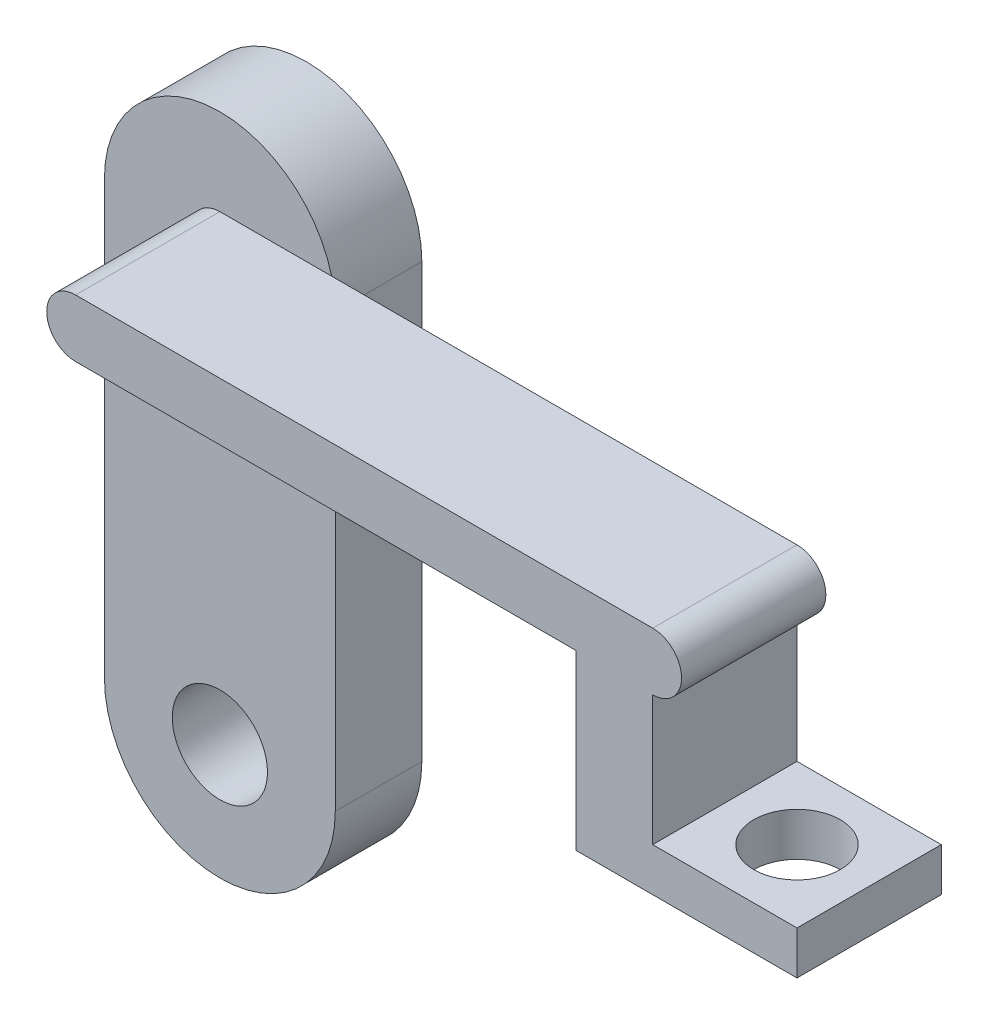
ISO-10303-21;
HEADER;
FILE_DESCRIPTION(('STEP AP214'),'2;1');
FILE_NAME('part.step','',(''),(''),'','','');
FILE_SCHEMA(('AUTOMOTIVE_DESIGN { 1 0 10303 214 1 1 1 1 }'));
ENDSEC;
DATA;
#1=APPLICATION_CONTEXT('core data for automotive mechanical design processes');
#2=APPLICATION_PROTOCOL_DEFINITION('international standard','automotive_design',2000,#1);
#3=PRODUCT_CONTEXT('',#1,'mechanical');
#4=PRODUCT('Part','Part','',(#3));
#5=PRODUCT_RELATED_PRODUCT_CATEGORY('part','',(#4));
#6=PRODUCT_DEFINITION_FORMATION('','',#4);
#7=PRODUCT_DEFINITION_CONTEXT('part definition',#1,'design');
#8=PRODUCT_DEFINITION('design','',#6,#7);
#9=PRODUCT_DEFINITION_SHAPE('','',#8);
#10=(LENGTH_UNIT() NAMED_UNIT(*) SI_UNIT(.MILLI.,.METRE.));
#11=(NAMED_UNIT(*) PLANE_ANGLE_UNIT() SI_UNIT($,.RADIAN.));
#12=(NAMED_UNIT(*) SI_UNIT($,.STERADIAN.) SOLID_ANGLE_UNIT());
#13=UNCERTAINTY_MEASURE_WITH_UNIT(LENGTH_MEASURE(1.E-05),#10,'distance_accuracy_value','');
#14=(GEOMETRIC_REPRESENTATION_CONTEXT(3) GLOBAL_UNCERTAINTY_ASSIGNED_CONTEXT((#13)) GLOBAL_UNIT_ASSIGNED_CONTEXT((#10,
#11,#12)) REPRESENTATION_CONTEXT('',''));
#15=CARTESIAN_POINT('',(0.,0.,0.));
#16=DIRECTION('',(0.,0.,1.));
#17=DIRECTION('',(1.,0.,0.));
#18=AXIS2_PLACEMENT_3D('',#15,#16,#17);
#19=CARTESIAN_POINT('',(20.,8.,8.));
#20=DIRECTION('',(-1.,0.,0.));
#21=DIRECTION('',(0.,0.,1.));
#22=AXIS2_PLACEMENT_3D('',#19,#20,#21);
#23=PLANE('',#22);
#24=DIRECTION('',(0.,0.,1.));
#25=VECTOR('',#24,1.);
#26=CARTESIAN_POINT('',(20.,9.50212823380525,8.));
#27=LINE('',#26,#25);
#28=CARTESIAN_POINT('',(20.,9.50212823380525,3.));
#29=VERTEX_POINT('',#28);
#30=CARTESIAN_POINT('',(20.,9.50212823380525,8.));
#31=VERTEX_POINT('',#30);
#32=EDGE_CURVE('E57',#29,#31,#27,.T.);
#33=ORIENTED_EDGE('',*,*,#32,.F.);
#34=DIRECTION('',(0.,1.,0.));
#35=VECTOR('',#34,1.);
#36=CARTESIAN_POINT('',(20.,8.,3.));
#37=LINE('',#36,#35);
#38=CARTESIAN_POINT('',(20.,14.,3.));
#39=VERTEX_POINT('',#38);
#40=EDGE_CURVE('E182',#29,#39,#37,.T.);
#41=ORIENTED_EDGE('',*,*,#40,.T.);
#42=DIRECTION('',(0.,0.,-1.));
#43=VECTOR('',#42,1.);
#44=CARTESIAN_POINT('',(20.,14.,8.));
#45=LINE('',#44,#43);
#46=CARTESIAN_POINT('',(20.,14.,8.));
#47=VERTEX_POINT('',#46);
#48=EDGE_CURVE('E219',#47,#39,#45,.T.);
#49=ORIENTED_EDGE('',*,*,#48,.F.);
#50=DIRECTION('',(0.,1.,0.));
#51=VECTOR('',#50,1.);
#52=CARTESIAN_POINT('',(20.,8.,8.));
#53=LINE('',#52,#51);
#54=EDGE_CURVE('E188',#31,#47,#53,.T.);
#55=ORIENTED_EDGE('',*,*,#54,.F.);
#56=EDGE_LOOP('',(#33,#41,#49,#55));
#57=FACE_BOUND('',#56,.T.);
#58=ADVANCED_FACE('F39',(#57),#23,.F.);
#59=CARTESIAN_POINT('',(0.,14.,8.));
#60=DIRECTION('',(0.,1.,0.));
#61=DIRECTION('',(0.,0.,1.));
#62=AXIS2_PLACEMENT_3D('',#59,#60,#61);
#63=PLANE('',#62);
#64=DIRECTION('',(0.,0.,-1.));
#65=VECTOR('',#64,1.);
#66=CARTESIAN_POINT('',(17.3441823212465,14.,8.));
#67=LINE('',#66,#65);
#68=CARTESIAN_POINT('',(17.3441823212465,14.,8.));
#69=VERTEX_POINT('',#68);
#70=CARTESIAN_POINT('',(17.3441823212465,14.,3.));
#71=VERTEX_POINT('',#70);
#72=EDGE_CURVE('E61',#69,#71,#67,.T.);
#73=ORIENTED_EDGE('',*,*,#72,.F.);
#74=DIRECTION('',(1.,0.,0.));
#75=VECTOR('',#74,1.);
#76=CARTESIAN_POINT('',(0.,14.,8.));
#77=LINE('',#76,#75);
#78=CARTESIAN_POINT('',(0.,14.,8.));
#79=VERTEX_POINT('',#78);
#80=EDGE_CURVE('E193',#79,#69,#77,.T.);
#81=ORIENTED_EDGE('',*,*,#80,.F.);
#82=DIRECTION('',(0.,0.,-1.));
#83=VECTOR('',#82,1.);
#84=CARTESIAN_POINT('',(0.,14.,8.));
#85=LINE('',#84,#83);
#86=CARTESIAN_POINT('',(0.,14.,3.));
#87=VERTEX_POINT('',#86);
#88=EDGE_CURVE('E218',#79,#87,#85,.T.);
#89=ORIENTED_EDGE('',*,*,#88,.T.);
#90=DIRECTION('',(1.,0.,0.));
#91=VECTOR('',#90,1.);
#92=CARTESIAN_POINT('',(0.,14.,3.));
#93=LINE('',#92,#91);
#94=CARTESIAN_POINT('',(4.,14.,3.));
#95=VERTEX_POINT('',#94);
#96=EDGE_CURVE('E203',#87,#95,#93,.T.);
#97=ORIENTED_EDGE('',*,*,#96,.T.);
#98=EDGE_CURVE('E201',#95,#71,#93,.T.);
#99=ORIENTED_EDGE('',*,*,#98,.T.);
#100=EDGE_LOOP('',(#73,#81,#89,#97,#99));
#101=FACE_BOUND('',#100,.T.);
#102=ADVANCED_FACE('F297',(#101),#63,.F.);
#103=CARTESIAN_POINT('',(0.,0.,3.));
#104=DIRECTION('',(0.,0.,1.));
#105=DIRECTION('',(1.,0.,0.));
#106=AXIS2_PLACEMENT_3D('',#103,#104,#105);
#107=PLANE('',#106);
#108=DIRECTION('',(-1.,0.,0.));
#109=VECTOR('',#108,1.);
#110=CARTESIAN_POINT('',(0.,16.,3.));
#111=LINE('',#110,#109);
#112=CARTESIAN_POINT('',(3.87298334620742,16.,3.));
#113=VERTEX_POINT('',#112);
#114=CARTESIAN_POINT('',(0.,16.,3.));
#115=VERTEX_POINT('',#114);
#116=EDGE_CURVE('E11',#113,#115,#111,.T.);
#117=ORIENTED_EDGE('',*,*,#116,.F.);
#118=CARTESIAN_POINT('',(0.,15.,3.));
#119=DIRECTION('',(0.,0.,1.));
#120=DIRECTION('',(1.,0.,0.));
#121=AXIS2_PLACEMENT_3D('',#118,#119,#120);
#122=CIRCLE('',#121,4.);
#123=CARTESIAN_POINT('',(-4.,15.,3.));
#124=VERTEX_POINT('',#123);
#125=EDGE_CURVE('E236',#113,#124,#122,.T.);
#126=ORIENTED_EDGE('',*,*,#125,.T.);
#127=DIRECTION('',(0.,-1.,0.));
#128=VECTOR('',#127,1.);
#129=CARTESIAN_POINT('',(-4.,0.,3.));
#130=LINE('',#129,#128);
#131=CARTESIAN_POINT('',(-4.,0.,3.));
#132=VERTEX_POINT('',#131);
#133=EDGE_CURVE('E239',#124,#132,#130,.T.);
#134=ORIENTED_EDGE('',*,*,#133,.T.);
#135=CARTESIAN_POINT('',(0.,0.,3.));
#136=DIRECTION('',(0.,0.,1.));
#137=DIRECTION('',(1.,0.,0.));
#138=AXIS2_PLACEMENT_3D('',#135,#136,#137);
#139=CIRCLE('',#138,4.);
#140=CARTESIAN_POINT('',(4.,0.,3.));
#141=VERTEX_POINT('',#140);
#142=EDGE_CURVE('E230',#132,#141,#139,.T.);
#143=ORIENTED_EDGE('',*,*,#142,.T.);
#144=DIRECTION('',(0.,1.,0.));
#145=VECTOR('',#144,1.);
#146=CARTESIAN_POINT('',(4.,0.,3.));
#147=LINE('',#146,#145);
#148=EDGE_CURVE('E234',#141,#95,#147,.T.);
#149=ORIENTED_EDGE('',*,*,#148,.T.);
#150=ORIENTED_EDGE('',*,*,#96,.F.);
#151=CARTESIAN_POINT('',(0.,15.,3.));
#152=DIRECTION('',(0.,0.,1.));
#153=DIRECTION('',(1.,0.,0.));
#154=AXIS2_PLACEMENT_3D('',#151,#152,#153);
#155=CIRCLE('',#154,1.);
#156=EDGE_CURVE('E195',#115,#87,#155,.T.);
#157=ORIENTED_EDGE('',*,*,#156,.F.);
#158=EDGE_LOOP('',(#117,#126,#134,#143,#149,#150,#157));
#159=FACE_BOUND('',#158,.T.);
#160=CARTESIAN_POINT('',(0.,0.,3.));
#161=DIRECTION('',(0.,0.,1.));
#162=DIRECTION('',(1.,0.,0.));
#163=AXIS2_PLACEMENT_3D('',#160,#161,#162);
#164=CIRCLE('',#163,1.65);
#165=CARTESIAN_POINT('',(1.65,0.,3.));
#166=VERTEX_POINT('',#165);
#167=EDGE_CURVE('E224',#166,#166,#164,.T.);
#168=ORIENTED_EDGE('',*,*,#167,.F.);
#169=EDGE_LOOP('',(#168));
#170=FACE_BOUND('',#169,.T.);
#171=ADVANCED_FACE('F276',(#159,#170),#107,.T.);
#172=CARTESIAN_POINT('',(0.,0.,0.));
#173=DIRECTION('',(0.,0.,1.));
#174=DIRECTION('',(1.,0.,0.));
#175=AXIS2_PLACEMENT_3D('',#172,#173,#174);
#176=PLANE('',#175);
#177=CARTESIAN_POINT('',(0.,0.,0.));
#178=DIRECTION('',(0.,0.,1.));
#179=DIRECTION('',(1.,0.,0.));
#180=AXIS2_PLACEMENT_3D('',#177,#178,#179);
#181=CIRCLE('',#180,4.);
#182=CARTESIAN_POINT('',(-4.,0.,0.));
#183=VERTEX_POINT('',#182);
#184=CARTESIAN_POINT('',(4.,0.,0.));
#185=VERTEX_POINT('',#184);
#186=EDGE_CURVE('E228',#183,#185,#181,.T.);
#187=ORIENTED_EDGE('',*,*,#186,.F.);
#188=DIRECTION('',(0.,-1.,0.));
#189=VECTOR('',#188,1.);
#190=CARTESIAN_POINT('',(-4.,0.,0.));
#191=LINE('',#190,#189);
#192=CARTESIAN_POINT('',(-4.,15.,0.));
#193=VERTEX_POINT('',#192);
#194=EDGE_CURVE('E231',#193,#183,#191,.T.);
#195=ORIENTED_EDGE('',*,*,#194,.F.);
#196=CARTESIAN_POINT('',(0.,15.,0.));
#197=DIRECTION('',(0.,0.,1.));
#198=DIRECTION('',(1.,0.,0.));
#199=AXIS2_PLACEMENT_3D('',#196,#197,#198);
#200=CIRCLE('',#199,4.);
#201=CARTESIAN_POINT('',(4.,15.,0.));
#202=VERTEX_POINT('',#201);
#203=EDGE_CURVE('E250',#202,#193,#200,.T.);
#204=ORIENTED_EDGE('',*,*,#203,.F.);
#205=DIRECTION('',(0.,1.,0.));
#206=VECTOR('',#205,1.);
#207=CARTESIAN_POINT('',(4.,0.,0.));
#208=LINE('',#207,#206);
#209=EDGE_CURVE('E244',#185,#202,#208,.T.);
#210=ORIENTED_EDGE('',*,*,#209,.F.);
#211=EDGE_LOOP('',(#187,#195,#204,#210));
#212=FACE_BOUND('',#211,.T.);
#213=CARTESIAN_POINT('',(0.,0.,0.));
#214=DIRECTION('',(0.,0.,1.));
#215=DIRECTION('',(1.,0.,0.));
#216=AXIS2_PLACEMENT_3D('',#213,#214,#215);
#217=CIRCLE('',#216,1.65);
#218=CARTESIAN_POINT('',(1.65,0.,0.));
#219=VERTEX_POINT('',#218);
#220=EDGE_CURVE('E225',#219,#219,#217,.T.);
#221=ORIENTED_EDGE('',*,*,#220,.T.);
#222=EDGE_LOOP('',(#221));
#223=FACE_BOUND('',#222,.T.);
#224=ADVANCED_FACE('F268',(#212,#223),#176,.F.);
#225=CARTESIAN_POINT('',(0.,0.,3.));
#226=DIRECTION('',(0.,0.,-1.));
#227=DIRECTION('',(-1.,0.,0.));
#228=AXIS2_PLACEMENT_3D('',#225,#226,#227);
#229=CYLINDRICAL_SURFACE('',#228,4.);
#230=ORIENTED_EDGE('',*,*,#186,.T.);
#231=DIRECTION('',(0.,0.,-1.));
#232=VECTOR('',#231,1.);
#233=CARTESIAN_POINT('',(4.,0.,3.));
#234=LINE('',#233,#232);
#235=EDGE_CURVE('E43',#141,#185,#234,.T.);
#236=ORIENTED_EDGE('',*,*,#235,.F.);
#237=ORIENTED_EDGE('',*,*,#142,.F.);
#238=DIRECTION('',(0.,0.,-1.));
#239=VECTOR('',#238,1.);
#240=CARTESIAN_POINT('',(-4.,0.,3.));
#241=LINE('',#240,#239);
#242=EDGE_CURVE('E245',#132,#183,#241,.T.);
#243=ORIENTED_EDGE('',*,*,#242,.T.);
#244=EDGE_LOOP('',(#230,#236,#237,#243));
#245=FACE_BOUND('',#244,.T.);
#246=ADVANCED_FACE('F41',(#245),#229,.T.);
#247=CARTESIAN_POINT('',(4.,0.,3.));
#248=DIRECTION('',(-1.,0.,0.));
#249=DIRECTION('',(0.,0.,1.));
#250=AXIS2_PLACEMENT_3D('',#247,#248,#249);
#251=PLANE('',#250);
#252=ORIENTED_EDGE('',*,*,#209,.T.);
#253=DIRECTION('',(0.,0.,-1.));
#254=VECTOR('',#253,1.);
#255=CARTESIAN_POINT('',(4.,15.,3.));
#256=LINE('',#255,#254);
#257=CARTESIAN_POINT('',(4.,15.,3.));
#258=VERTEX_POINT('',#257);
#259=EDGE_CURVE('E251',#258,#202,#256,.T.);
#260=ORIENTED_EDGE('',*,*,#259,.F.);
#261=EDGE_CURVE('E235',#95,#258,#147,.T.);
#262=ORIENTED_EDGE('',*,*,#261,.F.);
#263=ORIENTED_EDGE('',*,*,#148,.F.);
#264=ORIENTED_EDGE('',*,*,#235,.T.);
#265=EDGE_LOOP('',(#252,#260,#262,#263,#264));
#266=FACE_BOUND('',#265,.T.);
#267=ADVANCED_FACE('F261',(#266),#251,.F.);
#268=CARTESIAN_POINT('',(0.,15.,3.));
#269=DIRECTION('',(0.,0.,-1.));
#270=DIRECTION('',(-1.,0.,0.));
#271=AXIS2_PLACEMENT_3D('',#268,#269,#270);
#272=CYLINDRICAL_SURFACE('',#271,4.);
#273=ORIENTED_EDGE('',*,*,#203,.T.);
#274=DIRECTION('',(0.,0.,-1.));
#275=VECTOR('',#274,1.);
#276=CARTESIAN_POINT('',(-4.,15.,3.));
#277=LINE('',#276,#275);
#278=EDGE_CURVE('E255',#124,#193,#277,.T.);
#279=ORIENTED_EDGE('',*,*,#278,.F.);
#280=ORIENTED_EDGE('',*,*,#125,.F.);
#281=EDGE_CURVE('E240',#258,#113,#122,.T.);
#282=ORIENTED_EDGE('',*,*,#281,.F.);
#283=ORIENTED_EDGE('',*,*,#259,.T.);
#284=EDGE_LOOP('',(#273,#279,#280,#282,#283));
#285=FACE_BOUND('',#284,.T.);
#286=ADVANCED_FACE('F271',(#285),#272,.T.);
#287=CARTESIAN_POINT('',(-4.,0.,3.));
#288=DIRECTION('',(1.,0.,0.));
#289=DIRECTION('',(0.,0.,-1.));
#290=AXIS2_PLACEMENT_3D('',#287,#288,#289);
#291=PLANE('',#290);
#292=ORIENTED_EDGE('',*,*,#194,.T.);
#293=ORIENTED_EDGE('',*,*,#242,.F.);
#294=ORIENTED_EDGE('',*,*,#133,.F.);
#295=ORIENTED_EDGE('',*,*,#278,.T.);
#296=EDGE_LOOP('',(#292,#293,#294,#295));
#297=FACE_BOUND('',#296,.T.);
#298=ADVANCED_FACE('F280',(#297),#291,.F.);
#299=CARTESIAN_POINT('',(0.,0.,3.));
#300=DIRECTION('',(0.,0.,-1.));
#301=DIRECTION('',(-1.,0.,0.));
#302=AXIS2_PLACEMENT_3D('',#299,#300,#301);
#303=CYLINDRICAL_SURFACE('',#302,1.65);
#304=ORIENTED_EDGE('',*,*,#167,.T.);
#305=EDGE_LOOP('',(#304));
#306=FACE_BOUND('',#305,.T.);
#307=ORIENTED_EDGE('',*,*,#220,.F.);
#308=EDGE_LOOP('',(#307));
#309=FACE_BOUND('',#308,.T.);
#310=ADVANCED_FACE('F317',(#306,#309),#303,.F.);
#311=CARTESIAN_POINT('',(0.,15.,3.));
#312=DIRECTION('',(0.,0.,1.));
#313=DIRECTION('',(1.,0.,0.));
#314=AXIS2_PLACEMENT_3D('',#311,#312,#313);
#315=PLANE('',#314);
#316=ORIENTED_EDGE('',*,*,#98,.F.);
#317=ORIENTED_EDGE('',*,*,#261,.T.);
#318=ORIENTED_EDGE('',*,*,#281,.T.);
#319=CARTESIAN_POINT('',(20.,16.,3.));
#320=VERTEX_POINT('',#319);
#321=EDGE_CURVE('E47',#320,#113,#111,.T.);
#322=ORIENTED_EDGE('',*,*,#321,.F.);
#323=CARTESIAN_POINT('',(20.,15.,3.));
#324=DIRECTION('',(0.,0.,1.));
#325=DIRECTION('',(1.,0.,0.));
#326=AXIS2_PLACEMENT_3D('',#323,#324,#325);
#327=CIRCLE('',#326,1.);
#328=EDGE_CURVE('E206',#39,#320,#327,.T.);
#329=ORIENTED_EDGE('',*,*,#328,.F.);
#330=ORIENTED_EDGE('',*,*,#40,.F.);
#331=DIRECTION('',(-1.,0.,0.));
#332=VECTOR('',#331,1.);
#333=CARTESIAN_POINT('',(25.,9.50212823380525,3.));
#334=LINE('',#333,#332);
#335=CARTESIAN_POINT('',(25.,9.50212823380525,3.));
#336=VERTEX_POINT('',#335);
#337=EDGE_CURVE('E178',#336,#29,#334,.T.);
#338=ORIENTED_EDGE('',*,*,#337,.F.);
#339=DIRECTION('',(0.,1.,0.));
#340=VECTOR('',#339,1.);
#341=CARTESIAN_POINT('',(25.,8.,3.));
#342=LINE('',#341,#340);
#343=CARTESIAN_POINT('',(25.,8.,3.));
#344=VERTEX_POINT('',#343);
#345=EDGE_CURVE('E162',#344,#336,#342,.T.);
#346=ORIENTED_EDGE('',*,*,#345,.F.);
#347=DIRECTION('',(1.,0.,0.));
#348=VECTOR('',#347,1.);
#349=CARTESIAN_POINT('',(20.,8.,3.));
#350=LINE('',#349,#348);
#351=CARTESIAN_POINT('',(17.3441823212465,8.,3.));
#352=VERTEX_POINT('',#351);
#353=EDGE_CURVE('E156',#352,#344,#350,.T.);
#354=ORIENTED_EDGE('',*,*,#353,.F.);
#355=DIRECTION('',(0.,1.,0.));
#356=VECTOR('',#355,1.);
#357=CARTESIAN_POINT('',(17.3441823212465,8.,3.));
#358=LINE('',#357,#356);
#359=EDGE_CURVE('E187',#352,#71,#358,.T.);
#360=ORIENTED_EDGE('',*,*,#359,.T.);
#361=EDGE_LOOP('',(#316,#317,#318,#322,#329,#330,#338,#346,#354,#360));
#362=FACE_BOUND('',#361,.T.);
#363=ADVANCED_FACE('F282',(#362),#315,.F.);
#364=CARTESIAN_POINT('',(0.,15.,8.));
#365=DIRECTION('',(0.,0.,-1.));
#366=DIRECTION('',(-1.,0.,0.));
#367=AXIS2_PLACEMENT_3D('',#364,#365,#366);
#368=CYLINDRICAL_SURFACE('',#367,1.);
#369=ORIENTED_EDGE('',*,*,#156,.T.);
#370=ORIENTED_EDGE('',*,*,#88,.F.);
#371=CARTESIAN_POINT('',(0.,15.,8.));
#372=DIRECTION('',(0.,0.,1.));
#373=DIRECTION('',(1.,0.,0.));
#374=AXIS2_PLACEMENT_3D('',#371,#372,#373);
#375=CIRCLE('',#374,1.);
#376=CARTESIAN_POINT('',(0.,16.,8.));
#377=VERTEX_POINT('',#376);
#378=EDGE_CURVE('E194',#377,#79,#375,.T.);
#379=ORIENTED_EDGE('',*,*,#378,.F.);
#380=DIRECTION('',(0.,0.,-1.));
#381=VECTOR('',#380,1.);
#382=CARTESIAN_POINT('',(0.,16.,8.));
#383=LINE('',#382,#381);
#384=EDGE_CURVE('E202',#377,#115,#383,.T.);
#385=ORIENTED_EDGE('',*,*,#384,.T.);
#386=EDGE_LOOP('',(#369,#370,#379,#385));
#387=FACE_BOUND('',#386,.T.);
#388=ADVANCED_FACE('F314',(#387),#368,.T.);
#389=CARTESIAN_POINT('',(20.,15.,8.));
#390=DIRECTION('',(0.,0.,-1.));
#391=DIRECTION('',(-1.,0.,0.));
#392=AXIS2_PLACEMENT_3D('',#389,#390,#391);
#393=CYLINDRICAL_SURFACE('',#392,1.);
#394=ORIENTED_EDGE('',*,*,#328,.T.);
#395=DIRECTION('',(0.,0.,-1.));
#396=VECTOR('',#395,1.);
#397=CARTESIAN_POINT('',(20.,16.,8.));
#398=LINE('',#397,#396);
#399=CARTESIAN_POINT('',(20.,16.,8.));
#400=VERTEX_POINT('',#399);
#401=EDGE_CURVE('E214',#400,#320,#398,.T.);
#402=ORIENTED_EDGE('',*,*,#401,.F.);
#403=CARTESIAN_POINT('',(20.,15.,8.));
#404=DIRECTION('',(0.,0.,1.));
#405=DIRECTION('',(1.,0.,0.));
#406=AXIS2_PLACEMENT_3D('',#403,#404,#405);
#407=CIRCLE('',#406,1.);
#408=EDGE_CURVE('E196',#47,#400,#407,.T.);
#409=ORIENTED_EDGE('',*,*,#408,.F.);
#410=ORIENTED_EDGE('',*,*,#48,.T.);
#411=EDGE_LOOP('',(#394,#402,#409,#410));
#412=FACE_BOUND('',#411,.T.);
#413=ADVANCED_FACE('F295',(#412),#393,.T.);
#414=CARTESIAN_POINT('',(0.,16.,8.));
#415=DIRECTION('',(0.,-1.,0.));
#416=DIRECTION('',(0.,0.,-1.));
#417=AXIS2_PLACEMENT_3D('',#414,#415,#416);
#418=PLANE('',#417);
#419=ORIENTED_EDGE('',*,*,#321,.T.);
#420=ORIENTED_EDGE('',*,*,#116,.T.);
#421=ORIENTED_EDGE('',*,*,#384,.F.);
#422=DIRECTION('',(-1.,0.,0.));
#423=VECTOR('',#422,1.);
#424=CARTESIAN_POINT('',(0.,16.,8.));
#425=LINE('',#424,#423);
#426=EDGE_CURVE('E198',#400,#377,#425,.T.);
#427=ORIENTED_EDGE('',*,*,#426,.F.);
#428=ORIENTED_EDGE('',*,*,#401,.T.);
#429=EDGE_LOOP('',(#419,#420,#421,#427,#428));
#430=FACE_BOUND('',#429,.T.);
#431=ADVANCED_FACE('F289',(#430),#418,.F.);
#432=CARTESIAN_POINT('',(0.,15.,8.));
#433=DIRECTION('',(0.,0.,1.));
#434=DIRECTION('',(1.,0.,0.));
#435=AXIS2_PLACEMENT_3D('',#432,#433,#434);
#436=PLANE('',#435);
#437=ORIENTED_EDGE('',*,*,#378,.T.);
#438=ORIENTED_EDGE('',*,*,#80,.T.);
#439=DIRECTION('',(0.,1.,0.));
#440=VECTOR('',#439,1.);
#441=CARTESIAN_POINT('',(17.3441823212465,8.,8.));
#442=LINE('',#441,#440);
#443=CARTESIAN_POINT('',(17.3441823212465,8.,8.));
#444=VERTEX_POINT('',#443);
#445=EDGE_CURVE('E148',#444,#69,#442,.T.);
#446=ORIENTED_EDGE('',*,*,#445,.F.);
#447=DIRECTION('',(-1.,0.,0.));
#448=VECTOR('',#447,1.);
#449=CARTESIAN_POINT('',(20.,8.,8.));
#450=LINE('',#449,#448);
#451=CARTESIAN_POINT('',(25.,8.,8.));
#452=VERTEX_POINT('',#451);
#453=EDGE_CURVE('E145',#452,#444,#450,.T.);
#454=ORIENTED_EDGE('',*,*,#453,.F.);
#455=DIRECTION('',(0.,-1.,0.));
#456=VECTOR('',#455,1.);
#457=CARTESIAN_POINT('',(25.,8.,8.));
#458=LINE('',#457,#456);
#459=CARTESIAN_POINT('',(25.,9.50212823380525,8.));
#460=VERTEX_POINT('',#459);
#461=EDGE_CURVE('E149',#460,#452,#458,.T.);
#462=ORIENTED_EDGE('',*,*,#461,.F.);
#463=DIRECTION('',(-1.,0.,0.));
#464=VECTOR('',#463,1.);
#465=CARTESIAN_POINT('',(25.,9.50212823380525,8.));
#466=LINE('',#465,#464);
#467=EDGE_CURVE('E174',#460,#31,#466,.T.);
#468=ORIENTED_EDGE('',*,*,#467,.T.);
#469=ORIENTED_EDGE('',*,*,#54,.T.);
#470=ORIENTED_EDGE('',*,*,#408,.T.);
#471=ORIENTED_EDGE('',*,*,#426,.T.);
#472=EDGE_LOOP('',(#437,#438,#446,#454,#462,#468,#469,#470,#471));
#473=FACE_BOUND('',#472,.T.);
#474=ADVANCED_FACE('F143',(#473),#436,.T.);
#475=CARTESIAN_POINT('',(17.3441823212465,8.,8.));
#476=DIRECTION('',(1.,0.,0.));
#477=DIRECTION('',(0.,0.,-1.));
#478=AXIS2_PLACEMENT_3D('',#475,#476,#477);
#479=PLANE('',#478);
#480=ORIENTED_EDGE('',*,*,#72,.T.);
#481=ORIENTED_EDGE('',*,*,#359,.F.);
#482=DIRECTION('',(0.,0.,-1.));
#483=VECTOR('',#482,1.);
#484=CARTESIAN_POINT('',(17.3441823212465,8.,8.));
#485=LINE('',#484,#483);
#486=EDGE_CURVE('E155',#444,#352,#485,.T.);
#487=ORIENTED_EDGE('',*,*,#486,.F.);
#488=ORIENTED_EDGE('',*,*,#445,.T.);
#489=EDGE_LOOP('',(#480,#481,#487,#488));
#490=FACE_BOUND('',#489,.T.);
#491=ADVANCED_FACE('F309',(#490),#479,.F.);
#492=CARTESIAN_POINT('',(0.,8.,0.));
#493=DIRECTION('',(0.,1.,0.));
#494=DIRECTION('',(0.,0.,1.));
#495=AXIS2_PLACEMENT_3D('',#492,#493,#494);
#496=PLANE('',#495);
#497=CARTESIAN_POINT('',(22.5,8.,5.5));
#498=DIRECTION('',(0.,1.,0.));
#499=DIRECTION('',(0.,0.,1.));
#500=AXIS2_PLACEMENT_3D('',#497,#498,#499);
#501=CIRCLE('',#500,1.5);
#502=CARTESIAN_POINT('',(22.5,8.,7.));
#503=VERTEX_POINT('',#502);
#504=EDGE_CURVE('E169',#503,#503,#501,.T.);
#505=ORIENTED_EDGE('',*,*,#504,.T.);
#506=EDGE_LOOP('',(#505));
#507=FACE_BOUND('',#506,.T.);
#508=ORIENTED_EDGE('',*,*,#353,.T.);
#509=DIRECTION('',(0.,0.,-1.));
#510=VECTOR('',#509,1.);
#511=CARTESIAN_POINT('',(25.,8.,8.));
#512=LINE('',#511,#510);
#513=EDGE_CURVE('E157',#452,#344,#512,.T.);
#514=ORIENTED_EDGE('',*,*,#513,.F.);
#515=ORIENTED_EDGE('',*,*,#453,.T.);
#516=ORIENTED_EDGE('',*,*,#486,.T.);
#517=EDGE_LOOP('',(#508,#514,#515,#516));
#518=FACE_BOUND('',#517,.T.);
#519=ADVANCED_FACE('F160',(#507,#518),#496,.F.);
#520=CARTESIAN_POINT('',(25.,9.50212823380525,8.));
#521=DIRECTION('',(0.,-1.,0.));
#522=DIRECTION('',(0.,0.,-1.));
#523=AXIS2_PLACEMENT_3D('',#520,#521,#522);
#524=PLANE('',#523);
#525=CARTESIAN_POINT('',(22.5,9.50212823380525,5.5));
#526=DIRECTION('',(0.,1.,0.));
#527=DIRECTION('',(0.,0.,1.));
#528=AXIS2_PLACEMENT_3D('',#525,#526,#527);
#529=CIRCLE('',#528,1.5);
#530=CARTESIAN_POINT('',(22.5,9.50212823380525,7.));
#531=VERTEX_POINT('',#530);
#532=EDGE_CURVE('E474',#531,#531,#529,.T.);
#533=ORIENTED_EDGE('',*,*,#532,.F.);
#534=EDGE_LOOP('',(#533));
#535=FACE_BOUND('',#534,.T.);
#536=ORIENTED_EDGE('',*,*,#32,.T.);
#537=ORIENTED_EDGE('',*,*,#467,.F.);
#538=DIRECTION('',(0.,0.,1.));
#539=VECTOR('',#538,1.);
#540=CARTESIAN_POINT('',(25.,9.50212823380525,8.));
#541=LINE('',#540,#539);
#542=EDGE_CURVE('E168',#336,#460,#541,.T.);
#543=ORIENTED_EDGE('',*,*,#542,.F.);
#544=ORIENTED_EDGE('',*,*,#337,.T.);
#545=EDGE_LOOP('',(#536,#537,#543,#544));
#546=FACE_BOUND('',#545,.T.);
#547=ADVANCED_FACE('F296',(#535,#546),#524,.F.);
#548=CARTESIAN_POINT('',(25.,0.,0.));
#549=DIRECTION('',(-1.,0.,0.));
#550=DIRECTION('',(0.,0.,1.));
#551=AXIS2_PLACEMENT_3D('',#548,#549,#550);
#552=PLANE('',#551);
#553=ORIENTED_EDGE('',*,*,#461,.T.);
#554=ORIENTED_EDGE('',*,*,#513,.T.);
#555=ORIENTED_EDGE('',*,*,#345,.T.);
#556=ORIENTED_EDGE('',*,*,#542,.T.);
#557=EDGE_LOOP('',(#553,#554,#555,#556));
#558=FACE_BOUND('',#557,.T.);
#559=ADVANCED_FACE('F165',(#558),#552,.F.);
#560=CARTESIAN_POINT('',(22.5,4.50212823380525,5.5));
#561=DIRECTION('',(0.,1.,0.));
#562=DIRECTION('',(0.,0.,1.));
#563=AXIS2_PLACEMENT_3D('',#560,#561,#562);
#564=CYLINDRICAL_SURFACE('',#563,1.5);
#565=ORIENTED_EDGE('',*,*,#532,.T.);
#566=EDGE_LOOP('',(#565));
#567=FACE_BOUND('',#566,.T.);
#568=ORIENTED_EDGE('',*,*,#504,.F.);
#569=EDGE_LOOP('',(#568));
#570=FACE_BOUND('',#569,.T.);
#571=ADVANCED_FACE('F445',(#567,#570),#564,.F.);
#572=CLOSED_SHELL('',(#58,#102,#171,#224,#246,#267,#286,#298,#310,#363,#388,#413,#431,#474,#491,
#519,#547,#559,#571));
#573=MANIFOLD_SOLID_BREP('B2',#572);
#574=ADVANCED_BREP_SHAPE_REPRESENTATION('',(#18,#573),#14);
#575=SHAPE_DEFINITION_REPRESENTATION(#9,#574);
ENDSEC;
END-ISO-10303-21;
